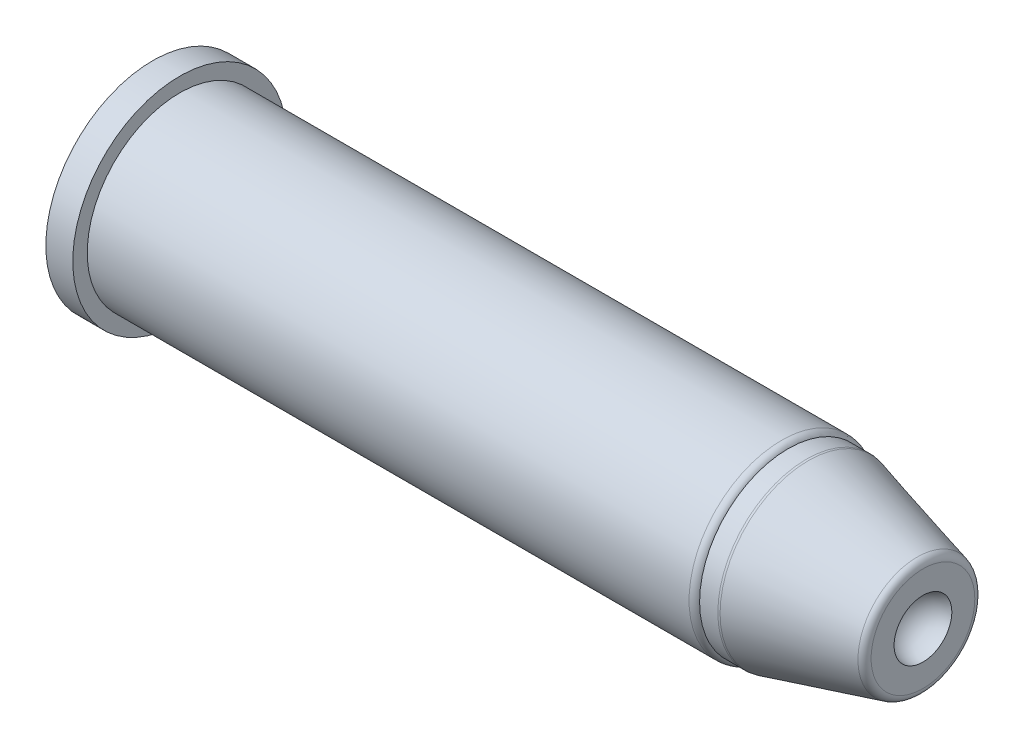
ISO-10303-21;
HEADER;
FILE_DESCRIPTION(('STEP AP214'),'2;1');
FILE_NAME('part.step','',(''),(''),'','','');
FILE_SCHEMA(('AUTOMOTIVE_DESIGN { 1 0 10303 214 1 1 1 1 }'));
ENDSEC;
DATA;
#1=APPLICATION_CONTEXT('core data for automotive mechanical design processes');
#2=APPLICATION_PROTOCOL_DEFINITION('international standard','automotive_design',2000,#1);
#3=PRODUCT_CONTEXT('',#1,'mechanical');
#4=PRODUCT('Part','Part','',(#3));
#5=PRODUCT_RELATED_PRODUCT_CATEGORY('part','',(#4));
#6=PRODUCT_DEFINITION_FORMATION('','',#4);
#7=PRODUCT_DEFINITION_CONTEXT('part definition',#1,'design');
#8=PRODUCT_DEFINITION('design','',#6,#7);
#9=PRODUCT_DEFINITION_SHAPE('','',#8);
#10=(LENGTH_UNIT() NAMED_UNIT(*) SI_UNIT(.MILLI.,.METRE.));
#11=(NAMED_UNIT(*) PLANE_ANGLE_UNIT() SI_UNIT($,.RADIAN.));
#12=(NAMED_UNIT(*) SI_UNIT($,.STERADIAN.) SOLID_ANGLE_UNIT());
#13=UNCERTAINTY_MEASURE_WITH_UNIT(LENGTH_MEASURE(1.E-05),#10,'distance_accuracy_value','');
#14=(GEOMETRIC_REPRESENTATION_CONTEXT(3) GLOBAL_UNCERTAINTY_ASSIGNED_CONTEXT((#13)) GLOBAL_UNIT_ASSIGNED_CONTEXT((#10,
#11,#12)) REPRESENTATION_CONTEXT('',''));
#15=CARTESIAN_POINT('',(0.,0.,0.));
#16=DIRECTION('',(0.,0.,1.));
#17=DIRECTION('',(1.,0.,0.));
#18=AXIS2_PLACEMENT_3D('',#15,#16,#17);
#19=CARTESIAN_POINT('',(40.,0.,0.));
#20=DIRECTION('',(1.,0.,0.));
#21=DIRECTION('',(0.,1.,0.));
#22=AXIS2_PLACEMENT_3D('',#19,#20,#21);
#23=SPHERICAL_SURFACE('',#22,1.5);
#24=CARTESIAN_POINT('',(40.,0.,0.));
#25=DIRECTION('',(1.,0.,0.));
#26=DIRECTION('',(0.,0.,-1.));
#27=AXIS2_PLACEMENT_3D('',#24,#25,#26);
#28=CIRCLE('',#27,1.5);
#29=CARTESIAN_POINT('',(40.,0.,-1.5));
#30=VERTEX_POINT('',#29);
#31=EDGE_CURVE('E59',#30,#30,#28,.T.);
#32=ORIENTED_EDGE('',*,*,#31,.T.);
#33=EDGE_LOOP('',(#32));
#34=FACE_BOUND('',#33,.T.);
#35=ADVANCED_FACE('F36',(#34),#23,.F.);
#36=CARTESIAN_POINT('',(40.,3.,0.));
#37=DIRECTION('',(1.,0.,0.));
#38=DIRECTION('',(0.,0.,-1.));
#39=AXIS2_PLACEMENT_3D('',#36,#37,#38);
#40=PLANE('',#39);
#41=CARTESIAN_POINT('',(40.,0.,0.));
#42=DIRECTION('',(1.,0.,0.));
#43=DIRECTION('',(0.,0.,-1.));
#44=AXIS2_PLACEMENT_3D('',#41,#42,#43);
#45=CIRCLE('',#44,2.6926886747664);
#46=CARTESIAN_POINT('',(40.,0.,-2.6926886747664));
#47=VERTEX_POINT('',#46);
#48=EDGE_CURVE('E43',#47,#47,#45,.T.);
#49=ORIENTED_EDGE('',*,*,#48,.T.);
#50=EDGE_LOOP('',(#49));
#51=FACE_BOUND('',#50,.T.);
#52=ORIENTED_EDGE('',*,*,#31,.F.);
#53=EDGE_LOOP('',(#52));
#54=FACE_BOUND('',#53,.T.);
#55=ADVANCED_FACE('F92',(#51,#54),#40,.T.);
#56=CARTESIAN_POINT('',(40.,0.,0.));
#57=DIRECTION('',(-1.,0.,0.));
#58=DIRECTION('',(0.,0.,1.));
#59=AXIS2_PLACEMENT_3D('',#56,#57,#58);
#60=CONICAL_SURFACE('',#59,3.,0.260602391747341);
#61=CARTESIAN_POINT('',(39.7030650602241,0.,0.));
#62=DIRECTION('',(1.,0.,0.));
#63=DIRECTION('',(0.,0.,-1.));
#64=AXIS2_PLACEMENT_3D('',#61,#62,#63);
#65=CIRCLE('',#64,3.0791826506069);
#66=CARTESIAN_POINT('',(39.7030650602241,0.,-3.0791826506069));
#67=VERTEX_POINT('',#66);
#68=EDGE_CURVE('E10',#67,#67,#65,.F.);
#69=ORIENTED_EDGE('',*,*,#68,.T.);
#70=EDGE_LOOP('',(#69));
#71=FACE_BOUND('',#70,.T.);
#72=CARTESIAN_POINT('',(34.0506475905981,0.,0.));
#73=DIRECTION('',(1.,0.,0.));
#74=DIRECTION('',(0.,0.,-1.));
#75=AXIS2_PLACEMENT_3D('',#72,#73,#74);
#76=CIRCLE('',#75,4.5864939758405);
#77=CARTESIAN_POINT('',(34.0506475905981,0.,-4.5864939758405));
#78=VERTEX_POINT('',#77);
#79=EDGE_CURVE('E51',#78,#78,#76,.T.);
#80=ORIENTED_EDGE('',*,*,#79,.T.);
#81=EDGE_LOOP('',(#80));
#82=FACE_BOUND('',#81,.T.);
#83=ADVANCED_FACE('F98',(#71,#82),#60,.T.);
#84=CARTESIAN_POINT('',(38.5,0.,0.));
#85=DIRECTION('',(1.,0.,0.));
#86=DIRECTION('',(0.,0.,-1.));
#87=AXIS2_PLACEMENT_3D('',#84,#85,#86);
#88=CYLINDRICAL_SURFACE('',#87,4.6);
#89=CARTESIAN_POINT('',(33.947582530374,0.,0.));
#90=DIRECTION('',(-1.,0.,0.));
#91=DIRECTION('',(0.,0.,1.));
#92=AXIS2_PLACEMENT_3D('',#89,#90,#91);
#93=CIRCLE('',#92,4.6);
#94=CARTESIAN_POINT('',(33.947582530374,0.,4.6));
#95=VERTEX_POINT('',#94);
#96=EDGE_CURVE('E47',#95,#95,#93,.T.);
#97=ORIENTED_EDGE('',*,*,#96,.T.);
#98=EDGE_LOOP('',(#97));
#99=FACE_BOUND('',#98,.T.);
#100=CARTESIAN_POINT('',(33.,0.,0.));
#101=DIRECTION('',(1.,0.,0.));
#102=DIRECTION('',(0.,0.,-1.));
#103=AXIS2_PLACEMENT_3D('',#100,#101,#102);
#104=CIRCLE('',#103,4.6);
#105=CARTESIAN_POINT('',(33.,0.,-4.6));
#106=VERTEX_POINT('',#105);
#107=EDGE_CURVE('E62',#106,#106,#104,.T.);
#108=ORIENTED_EDGE('',*,*,#107,.T.);
#109=EDGE_LOOP('',(#108));
#110=FACE_BOUND('',#109,.T.);
#111=ADVANCED_FACE('F112',(#99,#110),#88,.T.);
#112=CARTESIAN_POINT('',(38.5,0.,0.));
#113=DIRECTION('',(1.,0.,0.));
#114=DIRECTION('',(0.,0.,-1.));
#115=AXIS2_PLACEMENT_3D('',#112,#113,#114);
#116=CYLINDRICAL_SURFACE('',#115,4.8);
#117=CARTESIAN_POINT('',(32.6535898384862,0.,0.));
#118=DIRECTION('',(1.,0.,0.));
#119=DIRECTION('',(0.,0.,-1.));
#120=AXIS2_PLACEMENT_3D('',#117,#118,#119);
#121=CIRCLE('',#120,4.8);
#122=CARTESIAN_POINT('',(32.6535898384862,0.,-4.8));
#123=VERTEX_POINT('',#122);
#124=EDGE_CURVE('E56',#123,#123,#121,.F.);
#125=ORIENTED_EDGE('',*,*,#124,.T.);
#126=EDGE_LOOP('',(#125));
#127=FACE_BOUND('',#126,.T.);
#128=CARTESIAN_POINT('',(1.4,0.,0.));
#129=DIRECTION('',(1.,0.,0.));
#130=DIRECTION('',(0.,0.,-1.));
#131=AXIS2_PLACEMENT_3D('',#128,#129,#130);
#132=CIRCLE('',#131,4.8);
#133=CARTESIAN_POINT('',(1.4,0.,-4.8));
#134=VERTEX_POINT('',#133);
#135=EDGE_CURVE('E65',#134,#134,#132,.T.);
#136=ORIENTED_EDGE('',*,*,#135,.T.);
#137=EDGE_LOOP('',(#136));
#138=FACE_BOUND('',#137,.T.);
#139=ADVANCED_FACE('F116',(#127,#138),#116,.T.);
#140=CARTESIAN_POINT('',(1.4,5.55,0.));
#141=DIRECTION('',(1.,0.,0.));
#142=DIRECTION('',(0.,0.,-1.));
#143=AXIS2_PLACEMENT_3D('',#140,#141,#142);
#144=PLANE('',#143);
#145=CARTESIAN_POINT('',(1.4,0.,0.));
#146=DIRECTION('',(1.,0.,0.));
#147=DIRECTION('',(0.,0.,-1.));
#148=AXIS2_PLACEMENT_3D('',#145,#146,#147);
#149=CIRCLE('',#148,5.55);
#150=CARTESIAN_POINT('',(1.4,0.,-5.55));
#151=VERTEX_POINT('',#150);
#152=EDGE_CURVE('E68',#151,#151,#149,.T.);
#153=ORIENTED_EDGE('',*,*,#152,.T.);
#154=EDGE_LOOP('',(#153));
#155=FACE_BOUND('',#154,.T.);
#156=ORIENTED_EDGE('',*,*,#135,.F.);
#157=EDGE_LOOP('',(#156));
#158=FACE_BOUND('',#157,.T.);
#159=ADVANCED_FACE('F89',(#155,#158),#144,.T.);
#160=CARTESIAN_POINT('',(38.5,0.,0.));
#161=DIRECTION('',(1.,0.,0.));
#162=DIRECTION('',(0.,0.,-1.));
#163=AXIS2_PLACEMENT_3D('',#160,#161,#162);
#164=CYLINDRICAL_SURFACE('',#163,5.55);
#165=CARTESIAN_POINT('',(0.,0.,0.));
#166=DIRECTION('',(1.,0.,0.));
#167=DIRECTION('',(0.,0.,-1.));
#168=AXIS2_PLACEMENT_3D('',#165,#166,#167);
#169=CIRCLE('',#168,5.55);
#170=CARTESIAN_POINT('',(0.,0.,-5.55));
#171=VERTEX_POINT('',#170);
#172=EDGE_CURVE('E71',#171,#171,#169,.T.);
#173=ORIENTED_EDGE('',*,*,#172,.T.);
#174=EDGE_LOOP('',(#173));
#175=FACE_BOUND('',#174,.T.);
#176=ORIENTED_EDGE('',*,*,#152,.F.);
#177=EDGE_LOOP('',(#176));
#178=FACE_BOUND('',#177,.T.);
#179=ADVANCED_FACE('F75',(#175,#178),#164,.T.);
#180=CARTESIAN_POINT('',(0.,0.,0.));
#181=DIRECTION('',(-1.,0.,0.));
#182=DIRECTION('',(0.,0.,1.));
#183=AXIS2_PLACEMENT_3D('',#180,#181,#182);
#184=PLANE('',#183);
#185=ORIENTED_EDGE('',*,*,#172,.F.);
#186=EDGE_LOOP('',(#185));
#187=FACE_BOUND('',#186,.T.);
#188=ADVANCED_FACE('F78',(#187),#184,.T.);
#189=CARTESIAN_POINT('',(32.6535898384862,0.,0.));
#190=DIRECTION('',(1.,0.,0.));
#191=DIRECTION('',(0.,0.,-1.));
#192=AXIS2_PLACEMENT_3D('',#189,#190,#191);
#193=TOROIDAL_SURFACE('',#192,4.4,0.4);
#194=ORIENTED_EDGE('',*,*,#124,.F.);
#195=EDGE_LOOP('',(#194));
#196=FACE_BOUND('',#195,.T.);
#197=ORIENTED_EDGE('',*,*,#107,.F.);
#198=EDGE_LOOP('',(#197));
#199=FACE_BOUND('',#198,.T.);
#200=ADVANCED_FACE('F80',(#196,#199),#193,.T.);
#201=CARTESIAN_POINT('',(33.947582530374,0.,0.));
#202=DIRECTION('',(-1.,0.,0.));
#203=DIRECTION('',(0.,0.,1.));
#204=AXIS2_PLACEMENT_3D('',#201,#202,#203);
#205=TOROIDAL_SURFACE('',#204,4.2,0.4);
#206=ORIENTED_EDGE('',*,*,#96,.F.);
#207=EDGE_LOOP('',(#206));
#208=FACE_BOUND('',#207,.T.);
#209=ORIENTED_EDGE('',*,*,#79,.F.);
#210=EDGE_LOOP('',(#209));
#211=FACE_BOUND('',#210,.T.);
#212=ADVANCED_FACE('F86',(#208,#211),#205,.T.);
#213=CARTESIAN_POINT('',(39.6,0.,0.));
#214=DIRECTION('',(1.,0.,0.));
#215=DIRECTION('',(0.,0.,-1.));
#216=AXIS2_PLACEMENT_3D('',#213,#214,#215);
#217=TOROIDAL_SURFACE('',#216,2.6926886747664,0.4);
#218=ORIENTED_EDGE('',*,*,#68,.F.);
#219=EDGE_LOOP('',(#218));
#220=FACE_BOUND('',#219,.T.);
#221=ORIENTED_EDGE('',*,*,#48,.F.);
#222=EDGE_LOOP('',(#221));
#223=FACE_BOUND('',#222,.T.);
#224=ADVANCED_FACE('F38',(#220,#223),#217,.T.);
#225=CLOSED_SHELL('',(#35,#55,#83,#111,#139,#159,#179,#188,#200,#212,#224));
#226=MANIFOLD_SOLID_BREP('B2',#225);
#227=ADVANCED_BREP_SHAPE_REPRESENTATION('',(#18,#226),#14);
#228=SHAPE_DEFINITION_REPRESENTATION(#9,#227);
ENDSEC;
END-ISO-10303-21;
